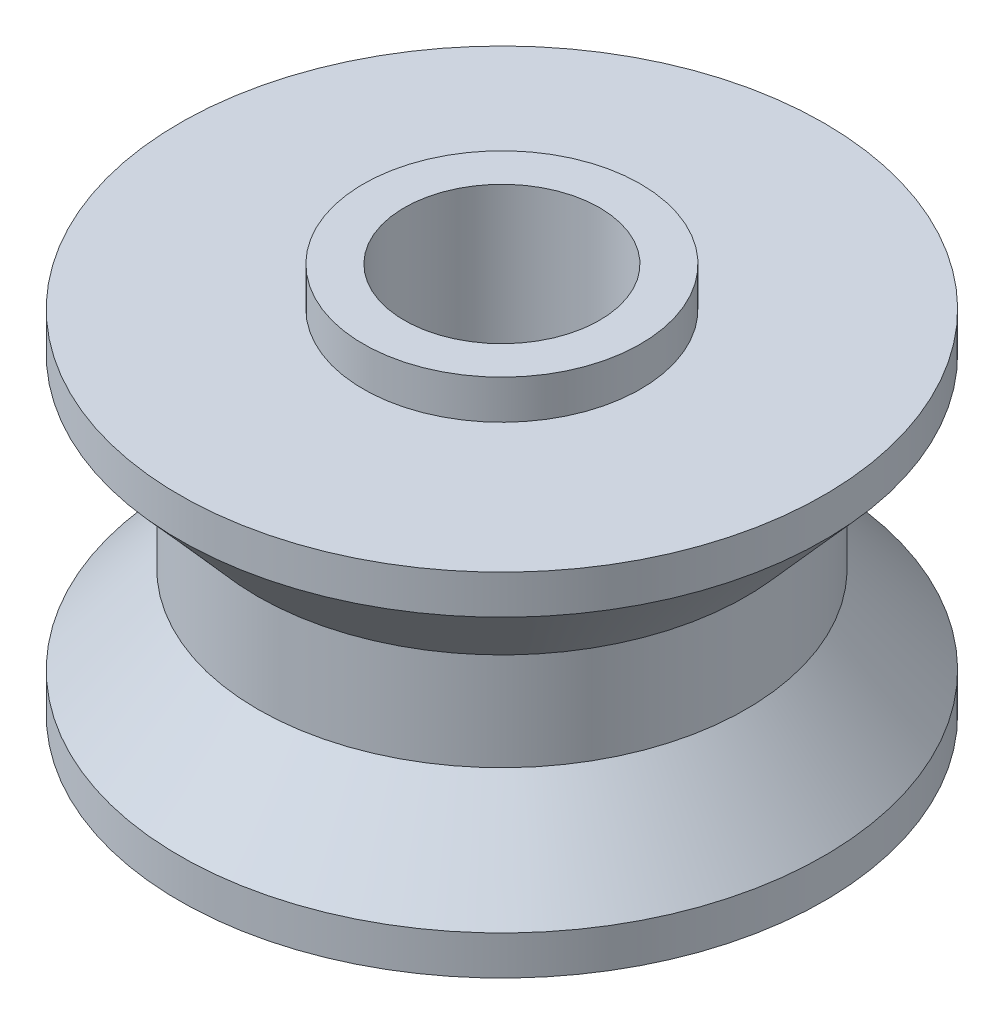
ISO-10303-21;
HEADER;
FILE_DESCRIPTION(('STEP AP214'),'2;1');
FILE_NAME('part.step','',(''),(''),'','','');
FILE_SCHEMA(('AUTOMOTIVE_DESIGN { 1 0 10303 214 1 1 1 1 }'));
ENDSEC;
DATA;
#1=APPLICATION_CONTEXT('core data for automotive mechanical design processes');
#2=APPLICATION_PROTOCOL_DEFINITION('international standard','automotive_design',2000,#1);
#3=PRODUCT_CONTEXT('',#1,'mechanical');
#4=PRODUCT('Part','Part','',(#3));
#5=PRODUCT_RELATED_PRODUCT_CATEGORY('part','',(#4));
#6=PRODUCT_DEFINITION_FORMATION('','',#4);
#7=PRODUCT_DEFINITION_CONTEXT('part definition',#1,'design');
#8=PRODUCT_DEFINITION('design','',#6,#7);
#9=PRODUCT_DEFINITION_SHAPE('','',#8);
#10=(LENGTH_UNIT() NAMED_UNIT(*) SI_UNIT(.MILLI.,.METRE.));
#11=(NAMED_UNIT(*) PLANE_ANGLE_UNIT() SI_UNIT($,.RADIAN.));
#12=(NAMED_UNIT(*) SI_UNIT($,.STERADIAN.) SOLID_ANGLE_UNIT());
#13=UNCERTAINTY_MEASURE_WITH_UNIT(LENGTH_MEASURE(1.E-05),#10,'distance_accuracy_value','');
#14=(GEOMETRIC_REPRESENTATION_CONTEXT(3) GLOBAL_UNCERTAINTY_ASSIGNED_CONTEXT((#13)) GLOBAL_UNIT_ASSIGNED_CONTEXT((#10,
#11,#12)) REPRESENTATION_CONTEXT('',''));
#15=CARTESIAN_POINT('',(0.,0.,0.));
#16=DIRECTION('',(0.,0.,1.));
#17=DIRECTION('',(1.,0.,0.));
#18=AXIS2_PLACEMENT_3D('',#15,#16,#17);
#19=CARTESIAN_POINT('',(0.,0.,0.));
#20=DIRECTION('',(0.,-1.,0.));
#21=DIRECTION('',(0.,0.,-1.));
#22=AXIS2_PLACEMENT_3D('',#19,#20,#21);
#23=CYLINDRICAL_SURFACE('',#22,2.5);
#24=CARTESIAN_POINT('',(0.,-5.5,0.));
#25=DIRECTION('',(0.,-1.,0.));
#26=DIRECTION('',(0.,0.,-1.));
#27=AXIS2_PLACEMENT_3D('',#24,#25,#26);
#28=CIRCLE('',#27,2.5);
#29=CARTESIAN_POINT('',(0.,-5.5,-2.5));
#30=VERTEX_POINT('',#29);
#31=EDGE_CURVE('E10',#30,#30,#28,.T.);
#32=ORIENTED_EDGE('',*,*,#31,.T.);
#33=EDGE_LOOP('',(#32));
#34=FACE_BOUND('',#33,.T.);
#35=CARTESIAN_POINT('',(0.,5.5,0.));
#36=DIRECTION('',(0.,-1.,0.));
#37=DIRECTION('',(0.,0.,-1.));
#38=AXIS2_PLACEMENT_3D('',#35,#36,#37);
#39=CIRCLE('',#38,2.5);
#40=CARTESIAN_POINT('',(0.,5.5,-2.5));
#41=VERTEX_POINT('',#40);
#42=EDGE_CURVE('E88',#41,#41,#39,.T.);
#43=ORIENTED_EDGE('',*,*,#42,.F.);
#44=EDGE_LOOP('',(#43));
#45=FACE_BOUND('',#44,.T.);
#46=ADVANCED_FACE('F37',(#34,#45),#23,.F.);
#47=CARTESIAN_POINT('',(2.5,-5.5,0.));
#48=DIRECTION('',(0.,-1.,0.));
#49=DIRECTION('',(0.,0.,-1.));
#50=AXIS2_PLACEMENT_3D('',#47,#48,#49);
#51=PLANE('',#50);
#52=CARTESIAN_POINT('',(0.,-5.5,0.));
#53=DIRECTION('',(0.,-1.,0.));
#54=DIRECTION('',(0.,0.,-1.));
#55=AXIS2_PLACEMENT_3D('',#52,#53,#54);
#56=CIRCLE('',#55,3.55);
#57=CARTESIAN_POINT('',(0.,-5.5,-3.55));
#58=VERTEX_POINT('',#57);
#59=EDGE_CURVE('E44',#58,#58,#56,.T.);
#60=ORIENTED_EDGE('',*,*,#59,.T.);
#61=EDGE_LOOP('',(#60));
#62=FACE_BOUND('',#61,.T.);
#63=ORIENTED_EDGE('',*,*,#31,.F.);
#64=EDGE_LOOP('',(#63));
#65=FACE_BOUND('',#64,.T.);
#66=ADVANCED_FACE('F97',(#62,#65),#51,.T.);
#67=CARTESIAN_POINT('',(0.,0.,0.));
#68=DIRECTION('',(0.,-1.,0.));
#69=DIRECTION('',(0.,0.,-1.));
#70=AXIS2_PLACEMENT_3D('',#67,#68,#69);
#71=CYLINDRICAL_SURFACE('',#70,3.55);
#72=CARTESIAN_POINT('',(0.,-4.5,0.));
#73=DIRECTION('',(0.,-1.,0.));
#74=DIRECTION('',(0.,0.,-1.));
#75=AXIS2_PLACEMENT_3D('',#72,#73,#74);
#76=CIRCLE('',#75,3.55);
#77=CARTESIAN_POINT('',(0.,-4.5,-3.55));
#78=VERTEX_POINT('',#77);
#79=EDGE_CURVE('E49',#78,#78,#76,.T.);
#80=ORIENTED_EDGE('',*,*,#79,.T.);
#81=EDGE_LOOP('',(#80));
#82=FACE_BOUND('',#81,.T.);
#83=ORIENTED_EDGE('',*,*,#59,.F.);
#84=EDGE_LOOP('',(#83));
#85=FACE_BOUND('',#84,.T.);
#86=ADVANCED_FACE('F101',(#82,#85),#71,.T.);
#87=CARTESIAN_POINT('',(3.55,-4.5,0.));
#88=DIRECTION('',(0.,-1.,0.));
#89=DIRECTION('',(0.,0.,-1.));
#90=AXIS2_PLACEMENT_3D('',#87,#88,#89);
#91=PLANE('',#90);
#92=CARTESIAN_POINT('',(0.,-4.5,0.));
#93=DIRECTION('',(0.,-1.,0.));
#94=DIRECTION('',(0.,0.,-1.));
#95=AXIS2_PLACEMENT_3D('',#92,#93,#94);
#96=CIRCLE('',#95,8.25);
#97=CARTESIAN_POINT('',(0.,-4.5,-8.25));
#98=VERTEX_POINT('',#97);
#99=EDGE_CURVE('E54',#98,#98,#96,.T.);
#100=ORIENTED_EDGE('',*,*,#99,.T.);
#101=EDGE_LOOP('',(#100));
#102=FACE_BOUND('',#101,.T.);
#103=ORIENTED_EDGE('',*,*,#79,.F.);
#104=EDGE_LOOP('',(#103));
#105=FACE_BOUND('',#104,.T.);
#106=ADVANCED_FACE('F105',(#102,#105),#91,.T.);
#107=CARTESIAN_POINT('',(0.,0.,0.));
#108=DIRECTION('',(0.,-1.,0.));
#109=DIRECTION('',(0.,0.,-1.));
#110=AXIS2_PLACEMENT_3D('',#107,#108,#109);
#111=CYLINDRICAL_SURFACE('',#110,8.25);
#112=CARTESIAN_POINT('',(0.,-3.5,0.));
#113=DIRECTION('',(0.,-1.,0.));
#114=DIRECTION('',(0.,0.,-1.));
#115=AXIS2_PLACEMENT_3D('',#112,#113,#114);
#116=CIRCLE('',#115,8.25);
#117=CARTESIAN_POINT('',(0.,-3.5,-8.25));
#118=VERTEX_POINT('',#117);
#119=EDGE_CURVE('E60',#118,#118,#116,.T.);
#120=ORIENTED_EDGE('',*,*,#119,.T.);
#121=EDGE_LOOP('',(#120));
#122=FACE_BOUND('',#121,.T.);
#123=ORIENTED_EDGE('',*,*,#99,.F.);
#124=EDGE_LOOP('',(#123));
#125=FACE_BOUND('',#124,.T.);
#126=ADVANCED_FACE('F112',(#122,#125),#111,.T.);
#127=CARTESIAN_POINT('',(0.,-3.5,0.));
#128=DIRECTION('',(0.,-1.,0.));
#129=DIRECTION('',(0.,0.,-1.));
#130=AXIS2_PLACEMENT_3D('',#127,#128,#129);
#131=CONICAL_SURFACE('',#130,8.25,0.726642340681726);
#132=CARTESIAN_POINT('',(0.,-1.25,0.));
#133=DIRECTION('',(0.,-1.,0.));
#134=DIRECTION('',(0.,0.,-1.));
#135=AXIS2_PLACEMENT_3D('',#132,#133,#134);
#136=CIRCLE('',#135,6.25);
#137=CARTESIAN_POINT('',(0.,-1.25,-6.25));
#138=VERTEX_POINT('',#137);
#139=EDGE_CURVE('E64',#138,#138,#136,.T.);
#140=ORIENTED_EDGE('',*,*,#139,.T.);
#141=EDGE_LOOP('',(#140));
#142=FACE_BOUND('',#141,.T.);
#143=ORIENTED_EDGE('',*,*,#119,.F.);
#144=EDGE_LOOP('',(#143));
#145=FACE_BOUND('',#144,.T.);
#146=ADVANCED_FACE('F116',(#142,#145),#131,.T.);
#147=CARTESIAN_POINT('',(0.,0.,0.));
#148=DIRECTION('',(0.,-1.,0.));
#149=DIRECTION('',(0.,0.,-1.));
#150=AXIS2_PLACEMENT_3D('',#147,#148,#149);
#151=CYLINDRICAL_SURFACE('',#150,6.25);
#152=CARTESIAN_POINT('',(0.,1.25,0.));
#153=DIRECTION('',(0.,-1.,0.));
#154=DIRECTION('',(0.,0.,-1.));
#155=AXIS2_PLACEMENT_3D('',#152,#153,#154);
#156=CIRCLE('',#155,6.25);
#157=CARTESIAN_POINT('',(0.,1.25,-6.25));
#158=VERTEX_POINT('',#157);
#159=EDGE_CURVE('E68',#158,#158,#156,.T.);
#160=ORIENTED_EDGE('',*,*,#159,.T.);
#161=EDGE_LOOP('',(#160));
#162=FACE_BOUND('',#161,.T.);
#163=ORIENTED_EDGE('',*,*,#139,.F.);
#164=EDGE_LOOP('',(#163));
#165=FACE_BOUND('',#164,.T.);
#166=ADVANCED_FACE('F120',(#162,#165),#151,.T.);
#167=CARTESIAN_POINT('',(0.,1.25,0.));
#168=DIRECTION('',(0.,1.,0.));
#169=DIRECTION('',(0.,0.,1.));
#170=AXIS2_PLACEMENT_3D('',#167,#168,#169);
#171=CONICAL_SURFACE('',#170,6.25,0.726642340681726);
#172=CARTESIAN_POINT('',(0.,3.5,0.));
#173=DIRECTION('',(0.,-1.,0.));
#174=DIRECTION('',(0.,0.,-1.));
#175=AXIS2_PLACEMENT_3D('',#172,#173,#174);
#176=CIRCLE('',#175,8.25);
#177=CARTESIAN_POINT('',(0.,3.5,-8.25));
#178=VERTEX_POINT('',#177);
#179=EDGE_CURVE('E72',#178,#178,#176,.T.);
#180=ORIENTED_EDGE('',*,*,#179,.T.);
#181=EDGE_LOOP('',(#180));
#182=FACE_BOUND('',#181,.T.);
#183=ORIENTED_EDGE('',*,*,#159,.F.);
#184=EDGE_LOOP('',(#183));
#185=FACE_BOUND('',#184,.T.);
#186=ADVANCED_FACE('F124',(#182,#185),#171,.T.);
#187=CARTESIAN_POINT('',(0.,0.,0.));
#188=DIRECTION('',(0.,-1.,0.));
#189=DIRECTION('',(0.,0.,-1.));
#190=AXIS2_PLACEMENT_3D('',#187,#188,#189);
#191=CYLINDRICAL_SURFACE('',#190,8.25);
#192=CARTESIAN_POINT('',(0.,4.5,0.));
#193=DIRECTION('',(0.,-1.,0.));
#194=DIRECTION('',(0.,0.,-1.));
#195=AXIS2_PLACEMENT_3D('',#192,#193,#194);
#196=CIRCLE('',#195,8.25);
#197=CARTESIAN_POINT('',(0.,4.5,-8.25));
#198=VERTEX_POINT('',#197);
#199=EDGE_CURVE('E76',#198,#198,#196,.T.);
#200=ORIENTED_EDGE('',*,*,#199,.T.);
#201=EDGE_LOOP('',(#200));
#202=FACE_BOUND('',#201,.T.);
#203=ORIENTED_EDGE('',*,*,#179,.F.);
#204=EDGE_LOOP('',(#203));
#205=FACE_BOUND('',#204,.T.);
#206=ADVANCED_FACE('F128',(#202,#205),#191,.T.);
#207=CARTESIAN_POINT('',(3.55,4.5,0.));
#208=DIRECTION('',(0.,1.,0.));
#209=DIRECTION('',(0.,0.,1.));
#210=AXIS2_PLACEMENT_3D('',#207,#208,#209);
#211=PLANE('',#210);
#212=CARTESIAN_POINT('',(0.,4.5,0.));
#213=DIRECTION('',(0.,-1.,0.));
#214=DIRECTION('',(0.,0.,-1.));
#215=AXIS2_PLACEMENT_3D('',#212,#213,#214);
#216=CIRCLE('',#215,3.55);
#217=CARTESIAN_POINT('',(0.,4.5,-3.55));
#218=VERTEX_POINT('',#217);
#219=EDGE_CURVE('E80',#218,#218,#216,.T.);
#220=ORIENTED_EDGE('',*,*,#219,.T.);
#221=EDGE_LOOP('',(#220));
#222=FACE_BOUND('',#221,.T.);
#223=ORIENTED_EDGE('',*,*,#199,.F.);
#224=EDGE_LOOP('',(#223));
#225=FACE_BOUND('',#224,.T.);
#226=ADVANCED_FACE('F132',(#222,#225),#211,.T.);
#227=CARTESIAN_POINT('',(0.,0.,0.));
#228=DIRECTION('',(0.,-1.,0.));
#229=DIRECTION('',(0.,0.,-1.));
#230=AXIS2_PLACEMENT_3D('',#227,#228,#229);
#231=CYLINDRICAL_SURFACE('',#230,3.55);
#232=CARTESIAN_POINT('',(0.,5.5,0.));
#233=DIRECTION('',(0.,-1.,0.));
#234=DIRECTION('',(0.,0.,-1.));
#235=AXIS2_PLACEMENT_3D('',#232,#233,#234);
#236=CIRCLE('',#235,3.55);
#237=CARTESIAN_POINT('',(0.,5.5,-3.55));
#238=VERTEX_POINT('',#237);
#239=EDGE_CURVE('E84',#238,#238,#236,.T.);
#240=ORIENTED_EDGE('',*,*,#239,.T.);
#241=EDGE_LOOP('',(#240));
#242=FACE_BOUND('',#241,.T.);
#243=ORIENTED_EDGE('',*,*,#219,.F.);
#244=EDGE_LOOP('',(#243));
#245=FACE_BOUND('',#244,.T.);
#246=ADVANCED_FACE('F136',(#242,#245),#231,.T.);
#247=CARTESIAN_POINT('',(2.5,5.5,0.));
#248=DIRECTION('',(0.,1.,0.));
#249=DIRECTION('',(0.,0.,1.));
#250=AXIS2_PLACEMENT_3D('',#247,#248,#249);
#251=PLANE('',#250);
#252=ORIENTED_EDGE('',*,*,#42,.T.);
#253=EDGE_LOOP('',(#252));
#254=FACE_BOUND('',#253,.T.);
#255=ORIENTED_EDGE('',*,*,#239,.F.);
#256=EDGE_LOOP('',(#255));
#257=FACE_BOUND('',#256,.T.);
#258=ADVANCED_FACE('F93',(#254,#257),#251,.T.);
#259=CLOSED_SHELL('',(#46,#66,#86,#106,#126,#146,#166,#186,#206,#226,#246,#258));
#260=MANIFOLD_SOLID_BREP('B2',#259);
#261=ADVANCED_BREP_SHAPE_REPRESENTATION('',(#18,#260),#14);
#262=SHAPE_DEFINITION_REPRESENTATION(#9,#261);
ENDSEC;
END-ISO-10303-21;
